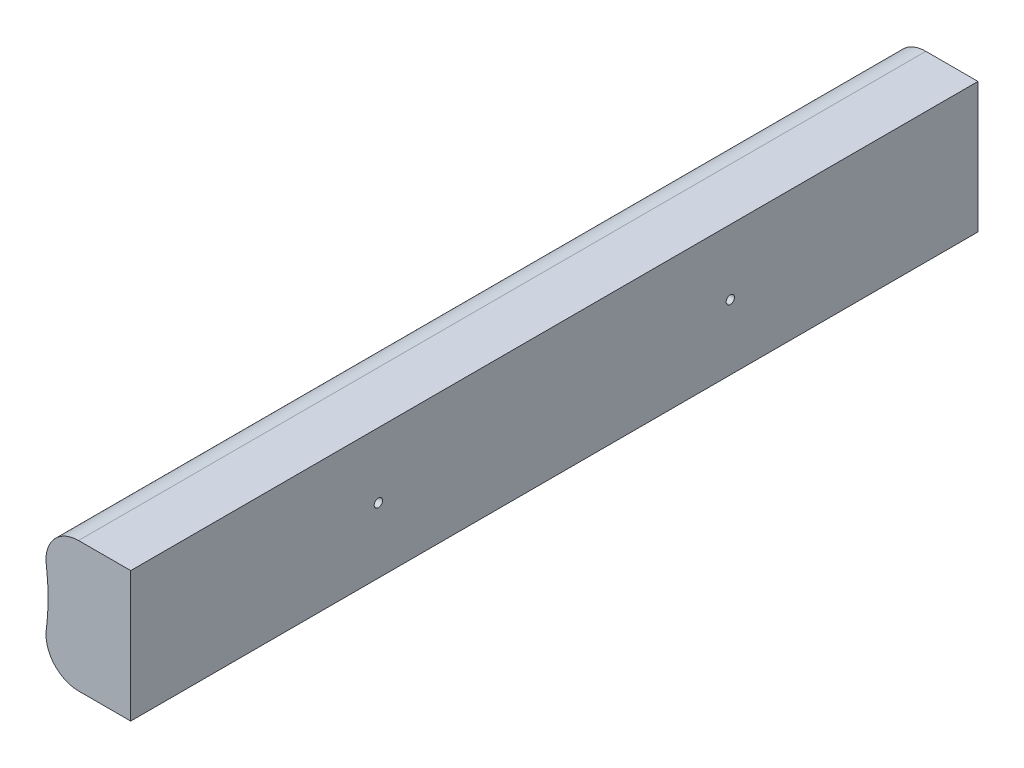
ISO-10303-21;
HEADER;
FILE_DESCRIPTION(('STEP AP214'),'2;1');
FILE_NAME('part.step','',(''),(''),'','','');
FILE_SCHEMA(('AUTOMOTIVE_DESIGN { 1 0 10303 214 1 1 1 1 }'));
ENDSEC;
DATA;
#1=APPLICATION_CONTEXT('core data for automotive mechanical design processes');
#2=APPLICATION_PROTOCOL_DEFINITION('international standard','automotive_design',2000,#1);
#3=PRODUCT_CONTEXT('',#1,'mechanical');
#4=PRODUCT('Part','Part','',(#3));
#5=PRODUCT_RELATED_PRODUCT_CATEGORY('part','',(#4));
#6=PRODUCT_DEFINITION_FORMATION('','',#4);
#7=PRODUCT_DEFINITION_CONTEXT('part definition',#1,'design');
#8=PRODUCT_DEFINITION('design','',#6,#7);
#9=PRODUCT_DEFINITION_SHAPE('','',#8);
#10=(LENGTH_UNIT() NAMED_UNIT(*) SI_UNIT(.MILLI.,.METRE.));
#11=(NAMED_UNIT(*) PLANE_ANGLE_UNIT() SI_UNIT($,.RADIAN.));
#12=(NAMED_UNIT(*) SI_UNIT($,.STERADIAN.) SOLID_ANGLE_UNIT());
#13=UNCERTAINTY_MEASURE_WITH_UNIT(LENGTH_MEASURE(1.E-05),#10,'distance_accuracy_value','');
#14=(GEOMETRIC_REPRESENTATION_CONTEXT(3) GLOBAL_UNCERTAINTY_ASSIGNED_CONTEXT((#13)) GLOBAL_UNIT_ASSIGNED_CONTEXT((#10,
#11,#12)) REPRESENTATION_CONTEXT('',''));
#15=CARTESIAN_POINT('',(0.,0.,0.));
#16=DIRECTION('',(0.,0.,1.));
#17=DIRECTION('',(1.,0.,0.));
#18=AXIS2_PLACEMENT_3D('',#15,#16,#17);
#19=CARTESIAN_POINT('',(-267.031514756728,0.,412.75));
#20=DIRECTION('',(0.,0.,-1.));
#21=DIRECTION('',(-1.,0.,0.));
#22=AXIS2_PLACEMENT_3D('',#19,#20,#21);
#23=CYLINDRICAL_SURFACE('',#22,186.630214138621);
#24=CARTESIAN_POINT('',(-267.031514756728,0.,-412.75));
#25=DIRECTION('',(0.,0.,-1.));
#26=DIRECTION('',(1.,0.,0.));
#27=AXIS2_PLACEMENT_3D('',#24,#25,#26);
#28=CIRCLE('',#27,186.630214138621);
#29=CARTESIAN_POINT('',(-81.4560069204938,19.8133218000225,-412.75));
#30=VERTEX_POINT('',#29);
#31=CARTESIAN_POINT('',(-81.4560069204938,-19.8133218000225,-412.75));
#32=VERTEX_POINT('',#31);
#33=EDGE_CURVE('E135',#30,#32,#28,.T.);
#34=ORIENTED_EDGE('',*,*,#33,.T.);
#35=DIRECTION('',(0.,0.,-1.));
#36=VECTOR('',#35,1.);
#37=CARTESIAN_POINT('',(-81.4560069204938,-19.8133218000225,412.75));
#38=LINE('',#37,#36);
#39=CARTESIAN_POINT('',(-81.4560069204938,-19.8133218000225,412.75));
#40=VERTEX_POINT('',#39);
#41=EDGE_CURVE('E11',#40,#32,#38,.T.);
#42=ORIENTED_EDGE('',*,*,#41,.F.);
#43=CARTESIAN_POINT('',(-267.031514756728,0.,412.75));
#44=DIRECTION('',(0.,0.,-1.));
#45=DIRECTION('',(1.,0.,0.));
#46=AXIS2_PLACEMENT_3D('',#43,#44,#45);
#47=CIRCLE('',#46,186.630214138621);
#48=CARTESIAN_POINT('',(-81.4560069204938,19.8133218000225,412.75));
#49=VERTEX_POINT('',#48);
#50=EDGE_CURVE('E150',#49,#40,#47,.T.);
#51=ORIENTED_EDGE('',*,*,#50,.F.);
#52=DIRECTION('',(0.,0.,-1.));
#53=VECTOR('',#52,1.);
#54=CARTESIAN_POINT('',(-81.4560069204938,19.8133218000225,412.75));
#55=LINE('',#54,#53);
#56=EDGE_CURVE('E131',#49,#30,#55,.T.);
#57=ORIENTED_EDGE('',*,*,#56,.T.);
#58=EDGE_LOOP('',(#34,#42,#51,#57));
#59=FACE_BOUND('',#58,.T.);
#60=ADVANCED_FACE('F36',(#59),#23,.F.);
#61=CARTESIAN_POINT('',(-81.4560069204938,-19.8133218000225,412.75));
#62=DIRECTION('',(0.994348684068897,-0.106163527119499,0.));
#63=DIRECTION('',(0.106163527119499,0.994348684068897,0.));
#64=AXIS2_PLACEMENT_3D('',#61,#62,#63);
#65=PLANE('',#64);
#66=DIRECTION('',(-0.106163527119499,-0.994348684068897,0.));
#67=VECTOR('',#66,1.);
#68=CARTESIAN_POINT('',(-81.4560069204938,-19.8133218000225,-412.75));
#69=LINE('',#68,#67);
#70=CARTESIAN_POINT('',(-82.3705707191875,-28.3793080139561,-412.75));
#71=VERTEX_POINT('',#70);
#72=EDGE_CURVE('E138',#32,#71,#69,.T.);
#73=ORIENTED_EDGE('',*,*,#72,.T.);
#74=DIRECTION('',(0.,0.,-1.));
#75=VECTOR('',#74,1.);
#76=CARTESIAN_POINT('',(-82.3705707191875,-28.3793080139561,412.75));
#77=LINE('',#76,#75);
#78=CARTESIAN_POINT('',(-82.3705707191875,-28.3793080139561,412.75));
#79=VERTEX_POINT('',#78);
#80=EDGE_CURVE('E44',#79,#71,#77,.T.);
#81=ORIENTED_EDGE('',*,*,#80,.F.);
#82=DIRECTION('',(-0.106163527119499,-0.994348684068897,0.));
#83=VECTOR('',#82,1.);
#84=CARTESIAN_POINT('',(-81.4560069204938,-19.8133218000225,412.75));
#85=LINE('',#84,#83);
#86=EDGE_CURVE('E96',#40,#79,#85,.T.);
#87=ORIENTED_EDGE('',*,*,#86,.F.);
#88=ORIENTED_EDGE('',*,*,#41,.T.);
#89=EDGE_LOOP('',(#73,#81,#87,#88));
#90=FACE_BOUND('',#89,.T.);
#91=ADVANCED_FACE('F218',(#90),#65,.F.);
#92=CARTESIAN_POINT('',(-50.8,-31.75,412.75));
#93=DIRECTION('',(0.,0.,-1.));
#94=DIRECTION('',(-1.,0.,0.));
#95=AXIS2_PLACEMENT_3D('',#92,#93,#94);
#96=CYLINDRICAL_SURFACE('',#95,31.75);
#97=CARTESIAN_POINT('',(-50.8,-31.75,-412.75));
#98=DIRECTION('',(0.,0.,1.));
#99=DIRECTION('',(1.,0.,0.));
#100=AXIS2_PLACEMENT_3D('',#97,#98,#99);
#101=CIRCLE('',#100,31.75);
#102=CARTESIAN_POINT('',(-50.8,-63.5,-412.75));
#103=VERTEX_POINT('',#102);
#104=EDGE_CURVE('E141',#71,#103,#101,.T.);
#105=ORIENTED_EDGE('',*,*,#104,.T.);
#106=DIRECTION('',(0.,0.,-1.));
#107=VECTOR('',#106,1.);
#108=CARTESIAN_POINT('',(-50.8,-63.5,412.75));
#109=LINE('',#108,#107);
#110=CARTESIAN_POINT('',(-50.8,-63.5,412.75));
#111=VERTEX_POINT('',#110);
#112=EDGE_CURVE('E157',#111,#103,#109,.T.);
#113=ORIENTED_EDGE('',*,*,#112,.F.);
#114=CARTESIAN_POINT('',(-50.8,-31.75,412.75));
#115=DIRECTION('',(0.,0.,1.));
#116=DIRECTION('',(1.,0.,0.));
#117=AXIS2_PLACEMENT_3D('',#114,#115,#116);
#118=CIRCLE('',#117,31.75);
#119=EDGE_CURVE('E165',#79,#111,#118,.T.);
#120=ORIENTED_EDGE('',*,*,#119,.F.);
#121=ORIENTED_EDGE('',*,*,#80,.T.);
#122=EDGE_LOOP('',(#105,#113,#120,#121));
#123=FACE_BOUND('',#122,.T.);
#124=ADVANCED_FACE('F163',(#123),#96,.T.);
#125=CARTESIAN_POINT('',(-50.8,-63.5,412.75));
#126=DIRECTION('',(0.,1.,0.));
#127=DIRECTION('',(-1.,0.,0.));
#128=AXIS2_PLACEMENT_3D('',#125,#126,#127);
#129=PLANE('',#128);
#130=DIRECTION('',(1.,0.,0.));
#131=VECTOR('',#130,1.);
#132=CARTESIAN_POINT('',(-50.8,-63.5,-412.75));
#133=LINE('',#132,#131);
#134=CARTESIAN_POINT('',(0.,-63.5,-412.75));
#135=VERTEX_POINT('',#134);
#136=EDGE_CURVE('E143',#103,#135,#133,.T.);
#137=ORIENTED_EDGE('',*,*,#136,.T.);
#138=DIRECTION('',(0.,0.,-1.));
#139=VECTOR('',#138,1.);
#140=CARTESIAN_POINT('',(0.,-63.5,412.75));
#141=LINE('',#140,#139);
#142=CARTESIAN_POINT('',(0.,-63.5,412.75));
#143=VERTEX_POINT('',#142);
#144=EDGE_CURVE('E154',#143,#135,#141,.T.);
#145=ORIENTED_EDGE('',*,*,#144,.F.);
#146=DIRECTION('',(1.,0.,0.));
#147=VECTOR('',#146,1.);
#148=CARTESIAN_POINT('',(-50.8,-63.5,412.75));
#149=LINE('',#148,#147);
#150=EDGE_CURVE('E177',#111,#143,#149,.T.);
#151=ORIENTED_EDGE('',*,*,#150,.F.);
#152=ORIENTED_EDGE('',*,*,#112,.T.);
#153=EDGE_LOOP('',(#137,#145,#151,#152));
#154=FACE_BOUND('',#153,.T.);
#155=ADVANCED_FACE('F173',(#154),#129,.F.);
#156=CARTESIAN_POINT('',(0.,-63.5,412.75));
#157=DIRECTION('',(-1.,0.,0.));
#158=DIRECTION('',(0.,-1.,0.));
#159=AXIS2_PLACEMENT_3D('',#156,#157,#158);
#160=PLANE('',#159);
#161=CARTESIAN_POINT('',(0.,0.,171.45));
#162=DIRECTION('',(1.,0.,0.));
#163=DIRECTION('',(0.,0.,-1.));
#164=AXIS2_PLACEMENT_3D('',#161,#162,#163);
#165=CIRCLE('',#164,4.064);
#166=CARTESIAN_POINT('',(0.,0.,167.386));
#167=VERTEX_POINT('',#166);
#168=EDGE_CURVE('E191',#167,#167,#165,.T.);
#169=ORIENTED_EDGE('',*,*,#168,.F.);
#170=EDGE_LOOP('',(#169));
#171=FACE_BOUND('',#170,.T.);
#172=CARTESIAN_POINT('',(0.,0.,-171.45));
#173=DIRECTION('',(1.,0.,0.));
#174=DIRECTION('',(0.,0.,-1.));
#175=AXIS2_PLACEMENT_3D('',#172,#173,#174);
#176=CIRCLE('',#175,4.064);
#177=CARTESIAN_POINT('',(0.,0.,-175.514));
#178=VERTEX_POINT('',#177);
#179=EDGE_CURVE('E185',#178,#178,#176,.T.);
#180=ORIENTED_EDGE('',*,*,#179,.F.);
#181=EDGE_LOOP('',(#180));
#182=FACE_BOUND('',#181,.T.);
#183=DIRECTION('',(0.,1.,0.));
#184=VECTOR('',#183,1.);
#185=CARTESIAN_POINT('',(0.,-63.5,-412.75));
#186=LINE('',#185,#184);
#187=CARTESIAN_POINT('',(0.,63.5,-412.75));
#188=VERTEX_POINT('',#187);
#189=EDGE_CURVE('E145',#135,#188,#186,.T.);
#190=ORIENTED_EDGE('',*,*,#189,.T.);
#191=DIRECTION('',(0.,0.,-1.));
#192=VECTOR('',#191,1.);
#193=CARTESIAN_POINT('',(0.,63.5,412.75));
#194=LINE('',#193,#192);
#195=CARTESIAN_POINT('',(0.,63.5,412.75));
#196=VERTEX_POINT('',#195);
#197=EDGE_CURVE('E126',#196,#188,#194,.T.);
#198=ORIENTED_EDGE('',*,*,#197,.F.);
#199=DIRECTION('',(0.,1.,0.));
#200=VECTOR('',#199,1.);
#201=CARTESIAN_POINT('',(0.,-63.5,412.75));
#202=LINE('',#201,#200);
#203=EDGE_CURVE('E117',#143,#196,#202,.T.);
#204=ORIENTED_EDGE('',*,*,#203,.F.);
#205=ORIENTED_EDGE('',*,*,#144,.T.);
#206=EDGE_LOOP('',(#190,#198,#204,#205));
#207=FACE_BOUND('',#206,.T.);
#208=ADVANCED_FACE('F176',(#171,#182,#207),#160,.F.);
#209=CARTESIAN_POINT('',(0.,63.5,412.75));
#210=DIRECTION('',(0.,-1.,0.));
#211=DIRECTION('',(1.,0.,0.));
#212=AXIS2_PLACEMENT_3D('',#209,#210,#211);
#213=PLANE('',#212);
#214=DIRECTION('',(-1.,0.,0.));
#215=VECTOR('',#214,1.);
#216=CARTESIAN_POINT('',(0.,63.5,-412.75));
#217=LINE('',#216,#215);
#218=CARTESIAN_POINT('',(-50.8,63.5,-412.75));
#219=VERTEX_POINT('',#218);
#220=EDGE_CURVE('E125',#188,#219,#217,.T.);
#221=ORIENTED_EDGE('',*,*,#220,.T.);
#222=DIRECTION('',(0.,0.,-1.));
#223=VECTOR('',#222,1.);
#224=CARTESIAN_POINT('',(-50.8,63.5,412.75));
#225=LINE('',#224,#223);
#226=CARTESIAN_POINT('',(-50.8,63.5,412.75));
#227=VERTEX_POINT('',#226);
#228=EDGE_CURVE('E122',#227,#219,#225,.T.);
#229=ORIENTED_EDGE('',*,*,#228,.F.);
#230=DIRECTION('',(-1.,0.,0.));
#231=VECTOR('',#230,1.);
#232=CARTESIAN_POINT('',(0.,63.5,412.75));
#233=LINE('',#232,#231);
#234=EDGE_CURVE('E111',#196,#227,#233,.T.);
#235=ORIENTED_EDGE('',*,*,#234,.F.);
#236=ORIENTED_EDGE('',*,*,#197,.T.);
#237=EDGE_LOOP('',(#221,#229,#235,#236));
#238=FACE_BOUND('',#237,.T.);
#239=ADVANCED_FACE('F123',(#238),#213,.F.);
#240=CARTESIAN_POINT('',(-50.8,31.75,412.75));
#241=DIRECTION('',(0.,0.,-1.));
#242=DIRECTION('',(-1.,0.,0.));
#243=AXIS2_PLACEMENT_3D('',#240,#241,#242);
#244=CYLINDRICAL_SURFACE('',#243,31.75);
#245=CARTESIAN_POINT('',(-50.8,31.75,-412.75));
#246=DIRECTION('',(0.,0.,1.));
#247=DIRECTION('',(1.,0.,0.));
#248=AXIS2_PLACEMENT_3D('',#245,#246,#247);
#249=CIRCLE('',#248,31.75);
#250=CARTESIAN_POINT('',(-82.3705707191875,28.379308013956,-412.75));
#251=VERTEX_POINT('',#250);
#252=EDGE_CURVE('E82',#219,#251,#249,.T.);
#253=ORIENTED_EDGE('',*,*,#252,.T.);
#254=DIRECTION('',(0.,0.,-1.));
#255=VECTOR('',#254,1.);
#256=CARTESIAN_POINT('',(-82.3705707191875,28.379308013956,412.75));
#257=LINE('',#256,#255);
#258=CARTESIAN_POINT('',(-82.3705707191875,28.379308013956,412.75));
#259=VERTEX_POINT('',#258);
#260=EDGE_CURVE('E127',#259,#251,#257,.T.);
#261=ORIENTED_EDGE('',*,*,#260,.F.);
#262=CARTESIAN_POINT('',(-50.8,31.75,412.75));
#263=DIRECTION('',(0.,0.,1.));
#264=DIRECTION('',(1.,0.,0.));
#265=AXIS2_PLACEMENT_3D('',#262,#263,#264);
#266=CIRCLE('',#265,31.75);
#267=EDGE_CURVE('E115',#227,#259,#266,.T.);
#268=ORIENTED_EDGE('',*,*,#267,.F.);
#269=ORIENTED_EDGE('',*,*,#228,.T.);
#270=EDGE_LOOP('',(#253,#261,#268,#269));
#271=FACE_BOUND('',#270,.T.);
#272=ADVANCED_FACE('F129',(#271),#244,.T.);
#273=CARTESIAN_POINT('',(-82.3705707191875,28.379308013956,412.75));
#274=DIRECTION('',(0.994348684068897,0.106163527119499,0.));
#275=DIRECTION('',(-0.106163527119499,0.994348684068897,0.));
#276=AXIS2_PLACEMENT_3D('',#273,#274,#275);
#277=PLANE('',#276);
#278=DIRECTION('',(0.106163527119499,-0.994348684068897,0.));
#279=VECTOR('',#278,1.);
#280=CARTESIAN_POINT('',(-82.3705707191875,28.379308013956,-412.75));
#281=LINE('',#280,#279);
#282=EDGE_CURVE('E88',#251,#30,#281,.T.);
#283=ORIENTED_EDGE('',*,*,#282,.T.);
#284=ORIENTED_EDGE('',*,*,#56,.F.);
#285=DIRECTION('',(0.106163527119499,-0.994348684068897,0.));
#286=VECTOR('',#285,1.);
#287=CARTESIAN_POINT('',(-82.3705707191875,28.379308013956,412.75));
#288=LINE('',#287,#286);
#289=EDGE_CURVE('E52',#259,#49,#288,.T.);
#290=ORIENTED_EDGE('',*,*,#289,.F.);
#291=ORIENTED_EDGE('',*,*,#260,.T.);
#292=EDGE_LOOP('',(#283,#284,#290,#291));
#293=FACE_BOUND('',#292,.T.);
#294=ADVANCED_FACE('F225',(#293),#277,.F.);
#295=CARTESIAN_POINT('',(-267.031514756728,0.,412.75));
#296=DIRECTION('',(0.,0.,1.));
#297=DIRECTION('',(1.,0.,0.));
#298=AXIS2_PLACEMENT_3D('',#295,#296,#297);
#299=PLANE('',#298);
#300=ORIENTED_EDGE('',*,*,#50,.T.);
#301=ORIENTED_EDGE('',*,*,#86,.T.);
#302=ORIENTED_EDGE('',*,*,#119,.T.);
#303=ORIENTED_EDGE('',*,*,#150,.T.);
#304=ORIENTED_EDGE('',*,*,#203,.T.);
#305=ORIENTED_EDGE('',*,*,#234,.T.);
#306=ORIENTED_EDGE('',*,*,#267,.T.);
#307=ORIENTED_EDGE('',*,*,#289,.T.);
#308=EDGE_LOOP('',(#300,#301,#302,#303,#304,#305,#306,#307));
#309=FACE_BOUND('',#308,.T.);
#310=ADVANCED_FACE('F113',(#309),#299,.T.);
#311=CARTESIAN_POINT('',(-267.031514756728,0.,-412.75));
#312=DIRECTION('',(0.,0.,1.));
#313=DIRECTION('',(1.,0.,0.));
#314=AXIS2_PLACEMENT_3D('',#311,#312,#313);
#315=PLANE('',#314);
#316=ORIENTED_EDGE('',*,*,#33,.F.);
#317=ORIENTED_EDGE('',*,*,#282,.F.);
#318=ORIENTED_EDGE('',*,*,#252,.F.);
#319=ORIENTED_EDGE('',*,*,#220,.F.);
#320=ORIENTED_EDGE('',*,*,#189,.F.);
#321=ORIENTED_EDGE('',*,*,#136,.F.);
#322=ORIENTED_EDGE('',*,*,#104,.F.);
#323=ORIENTED_EDGE('',*,*,#72,.F.);
#324=EDGE_LOOP('',(#316,#317,#318,#319,#320,#321,#322,#323));
#325=FACE_BOUND('',#324,.T.);
#326=ADVANCED_FACE('F169',(#325),#315,.F.);
#327=CARTESIAN_POINT('',(-19.05,0.,-171.45));
#328=DIRECTION('',(1.,0.,0.));
#329=DIRECTION('',(0.,0.,-1.));
#330=AXIS2_PLACEMENT_3D('',#327,#328,#329);
#331=CONICAL_SURFACE('',#330,4.06399999999999,1.02974425867665);
#332=CARTESIAN_POINT('',(-21.491897555728,0.,-171.45));
#333=VERTEX_POINT('',#332);
#334=VERTEX_LOOP('',#333);
#335=FACE_BOUND('',#334,.T.);
#336=CARTESIAN_POINT('',(-19.05,0.,-171.45));
#337=DIRECTION('',(1.,0.,0.));
#338=DIRECTION('',(0.,0.,-1.));
#339=AXIS2_PLACEMENT_3D('',#336,#337,#338);
#340=CIRCLE('',#339,4.06399999999999);
#341=CARTESIAN_POINT('',(-19.05,0.,-175.514));
#342=VERTEX_POINT('',#341);
#343=EDGE_CURVE('E139',#342,#342,#340,.T.);
#344=ORIENTED_EDGE('',*,*,#343,.T.);
#345=EDGE_LOOP('',(#344));
#346=FACE_BOUND('',#345,.T.);
#347=ADVANCED_FACE('F205',(#335,#346),#331,.F.);
#348=CARTESIAN_POINT('',(0.,0.,-171.45));
#349=DIRECTION('',(1.,0.,0.));
#350=DIRECTION('',(0.,0.,-1.));
#351=AXIS2_PLACEMENT_3D('',#348,#349,#350);
#352=CYLINDRICAL_SURFACE('',#351,4.064);
#353=ORIENTED_EDGE('',*,*,#343,.F.);
#354=EDGE_LOOP('',(#353));
#355=FACE_BOUND('',#354,.T.);
#356=ORIENTED_EDGE('',*,*,#179,.T.);
#357=EDGE_LOOP('',(#356));
#358=FACE_BOUND('',#357,.T.);
#359=ADVANCED_FACE('F202',(#355,#358),#352,.F.);
#360=CARTESIAN_POINT('',(-19.05,0.,171.45));
#361=DIRECTION('',(1.,0.,0.));
#362=DIRECTION('',(0.,0.,-1.));
#363=AXIS2_PLACEMENT_3D('',#360,#361,#362);
#364=CONICAL_SURFACE('',#363,4.06399999999999,1.02974425867665);
#365=CARTESIAN_POINT('',(-21.491897555728,0.,171.45));
#366=VERTEX_POINT('',#365);
#367=VERTEX_LOOP('',#366);
#368=FACE_BOUND('',#367,.T.);
#369=CARTESIAN_POINT('',(-19.05,0.,171.45));
#370=DIRECTION('',(1.,0.,0.));
#371=DIRECTION('',(0.,0.,-1.));
#372=AXIS2_PLACEMENT_3D('',#369,#370,#371);
#373=CIRCLE('',#372,4.06399999999999);
#374=CARTESIAN_POINT('',(-19.05,0.,167.386));
#375=VERTEX_POINT('',#374);
#376=EDGE_CURVE('E188',#375,#375,#373,.T.);
#377=ORIENTED_EDGE('',*,*,#376,.T.);
#378=EDGE_LOOP('',(#377));
#379=FACE_BOUND('',#378,.T.);
#380=ADVANCED_FACE('F204',(#368,#379),#364,.F.);
#381=CARTESIAN_POINT('',(0.,0.,171.45));
#382=DIRECTION('',(1.,0.,0.));
#383=DIRECTION('',(0.,0.,-1.));
#384=AXIS2_PLACEMENT_3D('',#381,#382,#383);
#385=CYLINDRICAL_SURFACE('',#384,4.064);
#386=ORIENTED_EDGE('',*,*,#376,.F.);
#387=EDGE_LOOP('',(#386));
#388=FACE_BOUND('',#387,.T.);
#389=ORIENTED_EDGE('',*,*,#168,.T.);
#390=EDGE_LOOP('',(#389));
#391=FACE_BOUND('',#390,.T.);
#392=ADVANCED_FACE('F195',(#388,#391),#385,.F.);
#393=CLOSED_SHELL('',(#60,#91,#124,#155,#208,#239,#272,#294,#310,#326,#347,#359,#380,#392));
#394=MANIFOLD_SOLID_BREP('B2',#393);
#395=ADVANCED_BREP_SHAPE_REPRESENTATION('',(#18,#394),#14);
#396=SHAPE_DEFINITION_REPRESENTATION(#9,#395);
ENDSEC;
END-ISO-10303-21;
